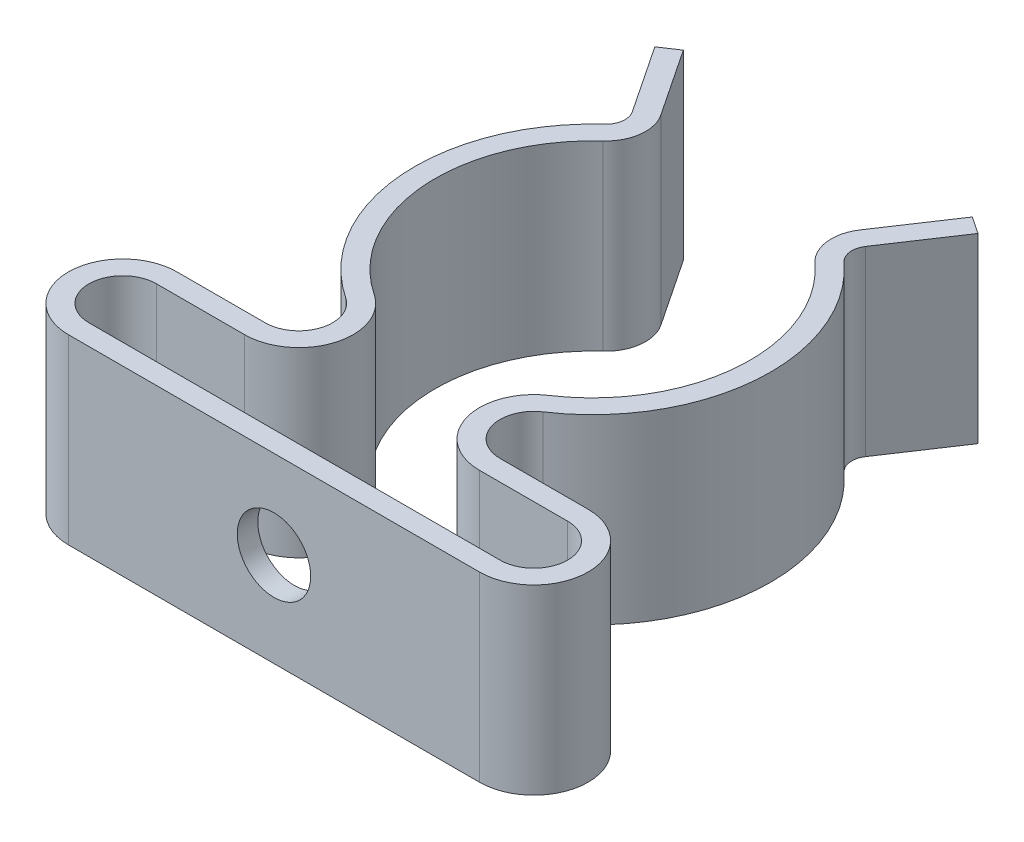
ISO-10303-21;
HEADER;
FILE_DESCRIPTION(('STEP AP214'),'2;1');
FILE_NAME('part.step','',(''),(''),'','','');
FILE_SCHEMA(('AUTOMOTIVE_DESIGN { 1 0 10303 214 1 1 1 1 }'));
ENDSEC;
DATA;
#1=APPLICATION_CONTEXT('core data for automotive mechanical design processes');
#2=APPLICATION_PROTOCOL_DEFINITION('international standard','automotive_design',2000,#1);
#3=PRODUCT_CONTEXT('',#1,'mechanical');
#4=PRODUCT('Part','Part','',(#3));
#5=PRODUCT_RELATED_PRODUCT_CATEGORY('part','',(#4));
#6=PRODUCT_DEFINITION_FORMATION('','',#4);
#7=PRODUCT_DEFINITION_CONTEXT('part definition',#1,'design');
#8=PRODUCT_DEFINITION('design','',#6,#7);
#9=PRODUCT_DEFINITION_SHAPE('','',#8);
#10=(LENGTH_UNIT() NAMED_UNIT(*) SI_UNIT(.MILLI.,.METRE.));
#11=(NAMED_UNIT(*) PLANE_ANGLE_UNIT() SI_UNIT($,.RADIAN.));
#12=(NAMED_UNIT(*) SI_UNIT($,.STERADIAN.) SOLID_ANGLE_UNIT());
#13=UNCERTAINTY_MEASURE_WITH_UNIT(LENGTH_MEASURE(1.E-05),#10,'distance_accuracy_value','');
#14=(GEOMETRIC_REPRESENTATION_CONTEXT(3) GLOBAL_UNCERTAINTY_ASSIGNED_CONTEXT((#13)) GLOBAL_UNIT_ASSIGNED_CONTEXT((#10,
#11,#12)) REPRESENTATION_CONTEXT('',''));
#15=CARTESIAN_POINT('',(0.,0.,0.));
#16=DIRECTION('',(0.,0.,1.));
#17=DIRECTION('',(1.,0.,0.));
#18=AXIS2_PLACEMENT_3D('',#15,#16,#17);
#19=CARTESIAN_POINT('',(-3.38987326577729,-0.2,-16.2157813718721));
#20=DIRECTION('',(0.832050294337843,0.,-0.554700196225229));
#21=DIRECTION('',(-0.554700196225229,0.,-0.832050294337843));
#22=AXIS2_PLACEMENT_3D('',#19,#20,#21);
#23=PLANE('',#22);
#24=DIRECTION('',(0.,1.,0.));
#25=VECTOR('',#24,1.);
#26=CARTESIAN_POINT('',(-4.91988494790974,-0.2,-18.5107988950708));
#27=LINE('',#26,#25);
#28=CARTESIAN_POINT('',(-4.91988494790974,-0.2,-18.5107988950708));
#29=VERTEX_POINT('',#28);
#30=CARTESIAN_POINT('',(-4.91988494790974,6.,-18.5107988950708));
#31=VERTEX_POINT('',#30);
#32=EDGE_CURVE('E34',#29,#31,#27,.T.);
#33=ORIENTED_EDGE('',*,*,#32,.T.);
#34=DIRECTION('',(-0.554700196225229,0.,-0.832050294337844));
#35=VECTOR('',#34,1.);
#36=CARTESIAN_POINT('',(-3.38987326577729,6.,-16.2157813718721));
#37=LINE('',#36,#35);
#38=CARTESIAN_POINT('',(-3.38987326577729,6.,-16.2157813718721));
#39=VERTEX_POINT('',#38);
#40=EDGE_CURVE('E215',#39,#31,#37,.T.);
#41=ORIENTED_EDGE('',*,*,#40,.F.);
#42=DIRECTION('',(0.,1.,0.));
#43=VECTOR('',#42,1.);
#44=CARTESIAN_POINT('',(-3.38987326577729,-0.2,-16.2157813718721));
#45=LINE('',#44,#43);
#46=CARTESIAN_POINT('',(-3.38987326577729,-0.2,-16.2157813718721));
#47=VERTEX_POINT('',#46);
#48=EDGE_CURVE('E11',#47,#39,#45,.T.);
#49=ORIENTED_EDGE('',*,*,#48,.F.);
#50=DIRECTION('',(-0.554700196225229,0.,-0.832050294337844));
#51=VECTOR('',#50,1.);
#52=CARTESIAN_POINT('',(-3.38987326577729,-0.2,-16.2157813718721));
#53=LINE('',#52,#51);
#54=EDGE_CURVE('E216',#47,#29,#53,.T.);
#55=ORIENTED_EDGE('',*,*,#54,.T.);
#56=EDGE_LOOP('',(#33,#41,#49,#55));
#57=FACE_BOUND('',#56,.T.);
#58=ADVANCED_FACE('F31',(#57),#23,.T.);
#59=CARTESIAN_POINT('',(-4.51314116313338,-0.2,-15.4669361069681));
#60=DIRECTION('',(0.,1.,0.));
#61=DIRECTION('',(0.,0.,1.));
#62=AXIS2_PLACEMENT_3D('',#59,#60,#61);
#63=CYLINDRICAL_SURFACE('',#62,1.35);
#64=ORIENTED_EDGE('',*,*,#48,.T.);
#65=CARTESIAN_POINT('',(-4.51314116313338,6.,-15.4669361069681));
#66=DIRECTION('',(0.,1.,0.));
#67=DIRECTION('',(1.,0.,0.));
#68=AXIS2_PLACEMENT_3D('',#65,#66,#67);
#69=CIRCLE('',#68,1.35);
#70=CARTESIAN_POINT('',(-3.60528131089679,6.,-14.4677912282358));
#71=VERTEX_POINT('',#70);
#72=EDGE_CURVE('E230',#71,#39,#69,.T.);
#73=ORIENTED_EDGE('',*,*,#72,.F.);
#74=DIRECTION('',(0.,1.,0.));
#75=VECTOR('',#74,1.);
#76=CARTESIAN_POINT('',(-3.60528131089679,-0.2,-14.4677912282358));
#77=LINE('',#76,#75);
#78=CARTESIAN_POINT('',(-3.60528131089679,-0.2,-14.4677912282358));
#79=VERTEX_POINT('',#78);
#80=EDGE_CURVE('E39',#79,#71,#77,.T.);
#81=ORIENTED_EDGE('',*,*,#80,.F.);
#82=CARTESIAN_POINT('',(-4.51314116313338,-0.2,-15.4669361069681));
#83=DIRECTION('',(0.,1.,0.));
#84=DIRECTION('',(1.,0.,0.));
#85=AXIS2_PLACEMENT_3D('',#82,#83,#84);
#86=CIRCLE('',#85,1.35);
#87=EDGE_CURVE('E221',#79,#47,#86,.T.);
#88=ORIENTED_EDGE('',*,*,#87,.T.);
#89=EDGE_LOOP('',(#64,#73,#81,#88));
#90=FACE_BOUND('',#89,.T.);
#91=ADVANCED_FACE('F539',(#90),#63,.T.);
#92=CARTESIAN_POINT('',(0.,-0.2,-10.5));
#93=DIRECTION('',(0.,1.,0.));
#94=DIRECTION('',(0.,0.,1.));
#95=AXIS2_PLACEMENT_3D('',#92,#93,#94);
#96=CYLINDRICAL_SURFACE('',#95,5.36110255092798);
#97=ORIENTED_EDGE('',*,*,#80,.T.);
#98=CARTESIAN_POINT('',(0.,6.,-10.5));
#99=DIRECTION('',(0.,1.,0.));
#100=DIRECTION('',(1.,0.,0.));
#101=AXIS2_PLACEMENT_3D('',#98,#99,#100);
#102=CIRCLE('',#101,5.36110255092798);
#103=CARTESIAN_POINT('',(-2.97380463698333,6.,-6.03929304452501));
#104=VERTEX_POINT('',#103);
#105=EDGE_CURVE('E309',#104,#71,#102,.F.);
#106=ORIENTED_EDGE('',*,*,#105,.F.);
#107=DIRECTION('',(0.,1.,0.));
#108=VECTOR('',#107,1.);
#109=CARTESIAN_POINT('',(-2.97380463698333,-0.2,-6.03929304452501));
#110=LINE('',#109,#108);
#111=CARTESIAN_POINT('',(-2.97380463698333,-0.2,-6.03929304452501));
#112=VERTEX_POINT('',#111);
#113=EDGE_CURVE('E377',#112,#104,#110,.T.);
#114=ORIENTED_EDGE('',*,*,#113,.F.);
#115=CARTESIAN_POINT('',(0.,-0.2,-10.5));
#116=DIRECTION('',(0.,1.,0.));
#117=DIRECTION('',(1.,0.,0.));
#118=AXIS2_PLACEMENT_3D('',#115,#116,#117);
#119=CIRCLE('',#118,5.36110255092798);
#120=EDGE_CURVE('E373',#112,#79,#119,.F.);
#121=ORIENTED_EDGE('',*,*,#120,.T.);
#122=EDGE_LOOP('',(#97,#106,#114,#121));
#123=FACE_BOUND('',#122,.T.);
#124=ADVANCED_FACE('F538',(#123),#96,.F.);
#125=CARTESIAN_POINT('',(-4.,-0.2,-4.5));
#126=DIRECTION('',(0.,1.,0.));
#127=DIRECTION('',(0.,0.,1.));
#128=AXIS2_PLACEMENT_3D('',#125,#126,#127);
#129=CYLINDRICAL_SURFACE('',#128,1.85);
#130=ORIENTED_EDGE('',*,*,#113,.T.);
#131=CARTESIAN_POINT('',(-4.,6.,-4.5));
#132=DIRECTION('',(0.,1.,0.));
#133=DIRECTION('',(1.,0.,0.));
#134=AXIS2_PLACEMENT_3D('',#131,#132,#133);
#135=CIRCLE('',#134,1.85);
#136=CARTESIAN_POINT('',(-4.,6.,-2.65));
#137=VERTEX_POINT('',#136);
#138=EDGE_CURVE('E306',#137,#104,#135,.T.);
#139=ORIENTED_EDGE('',*,*,#138,.F.);
#140=DIRECTION('',(0.,1.,0.));
#141=VECTOR('',#140,1.);
#142=CARTESIAN_POINT('',(-4.,-0.2,-2.65));
#143=LINE('',#142,#141);
#144=CARTESIAN_POINT('',(-4.,-0.2,-2.65));
#145=VERTEX_POINT('',#144);
#146=EDGE_CURVE('E379',#145,#137,#143,.T.);
#147=ORIENTED_EDGE('',*,*,#146,.F.);
#148=CARTESIAN_POINT('',(-4.,-0.2,-4.5));
#149=DIRECTION('',(0.,1.,0.));
#150=DIRECTION('',(1.,0.,0.));
#151=AXIS2_PLACEMENT_3D('',#148,#149,#150);
#152=CIRCLE('',#151,1.85);
#153=EDGE_CURVE('E370',#145,#112,#152,.T.);
#154=ORIENTED_EDGE('',*,*,#153,.T.);
#155=EDGE_LOOP('',(#130,#139,#147,#154));
#156=FACE_BOUND('',#155,.T.);
#157=ADVANCED_FACE('F534',(#156),#129,.T.);
#158=CARTESIAN_POINT('',(-7.,-0.2,-2.65));
#159=DIRECTION('',(0.,0.,1.));
#160=DIRECTION('',(1.,0.,0.));
#161=AXIS2_PLACEMENT_3D('',#158,#159,#160);
#162=PLANE('',#161);
#163=ORIENTED_EDGE('',*,*,#146,.T.);
#164=DIRECTION('',(1.,0.,0.));
#165=VECTOR('',#164,1.);
#166=CARTESIAN_POINT('',(-7.,6.,-2.65));
#167=LINE('',#166,#165);
#168=CARTESIAN_POINT('',(-7.,6.,-2.65));
#169=VERTEX_POINT('',#168);
#170=EDGE_CURVE('E303',#169,#137,#167,.T.);
#171=ORIENTED_EDGE('',*,*,#170,.F.);
#172=DIRECTION('',(0.,1.,0.));
#173=VECTOR('',#172,1.);
#174=CARTESIAN_POINT('',(-7.,-0.2,-2.65));
#175=LINE('',#174,#173);
#176=CARTESIAN_POINT('',(-7.,-0.2,-2.65));
#177=VERTEX_POINT('',#176);
#178=EDGE_CURVE('E381',#177,#169,#175,.T.);
#179=ORIENTED_EDGE('',*,*,#178,.F.);
#180=DIRECTION('',(1.,0.,0.));
#181=VECTOR('',#180,1.);
#182=CARTESIAN_POINT('',(-7.,-0.2,-2.65));
#183=LINE('',#182,#181);
#184=EDGE_CURVE('E367',#177,#145,#183,.T.);
#185=ORIENTED_EDGE('',*,*,#184,.T.);
#186=EDGE_LOOP('',(#163,#171,#179,#185));
#187=FACE_BOUND('',#186,.T.);
#188=ADVANCED_FACE('F529',(#187),#162,.T.);
#189=CARTESIAN_POINT('',(-7.,-0.2,-1.5));
#190=DIRECTION('',(0.,1.,0.));
#191=DIRECTION('',(0.,0.,1.));
#192=AXIS2_PLACEMENT_3D('',#189,#190,#191);
#193=CYLINDRICAL_SURFACE('',#192,1.15);
#194=ORIENTED_EDGE('',*,*,#178,.T.);
#195=CARTESIAN_POINT('',(-7.,6.,-1.5));
#196=DIRECTION('',(0.,1.,0.));
#197=DIRECTION('',(1.,0.,0.));
#198=AXIS2_PLACEMENT_3D('',#195,#196,#197);
#199=CIRCLE('',#198,1.15);
#200=CARTESIAN_POINT('',(-7.,6.,-0.35));
#201=VERTEX_POINT('',#200);
#202=EDGE_CURVE('E300',#201,#169,#199,.F.);
#203=ORIENTED_EDGE('',*,*,#202,.F.);
#204=DIRECTION('',(0.,1.,0.));
#205=VECTOR('',#204,1.);
#206=CARTESIAN_POINT('',(-7.,-0.2,-0.35));
#207=LINE('',#206,#205);
#208=CARTESIAN_POINT('',(-7.,-0.2,-0.35));
#209=VERTEX_POINT('',#208);
#210=EDGE_CURVE('E383',#209,#201,#207,.T.);
#211=ORIENTED_EDGE('',*,*,#210,.F.);
#212=CARTESIAN_POINT('',(-7.,-0.2,-1.5));
#213=DIRECTION('',(0.,1.,0.));
#214=DIRECTION('',(1.,0.,0.));
#215=AXIS2_PLACEMENT_3D('',#212,#213,#214);
#216=CIRCLE('',#215,1.15);
#217=EDGE_CURVE('E364',#209,#177,#216,.F.);
#218=ORIENTED_EDGE('',*,*,#217,.T.);
#219=EDGE_LOOP('',(#194,#203,#211,#218));
#220=FACE_BOUND('',#219,.T.);
#221=ADVANCED_FACE('F527',(#220),#193,.F.);
#222=CARTESIAN_POINT('',(-7.,-0.2,-0.35));
#223=DIRECTION('',(0.,0.,-1.));
#224=DIRECTION('',(-1.,0.,0.));
#225=AXIS2_PLACEMENT_3D('',#222,#223,#224);
#226=PLANE('',#225);
#227=CARTESIAN_POINT('',(0.,3.,-0.35));
#228=DIRECTION('',(0.,0.,-1.));
#229=DIRECTION('',(-1.,0.,0.));
#230=AXIS2_PLACEMENT_3D('',#227,#228,#229);
#231=CIRCLE('',#230,1.25);
#232=CARTESIAN_POINT('',(-1.25,3.,-0.35));
#233=VERTEX_POINT('',#232);
#234=EDGE_CURVE('E617',#233,#233,#231,.F.);
#235=ORIENTED_EDGE('',*,*,#234,.T.);
#236=EDGE_LOOP('',(#235));
#237=FACE_BOUND('',#236,.T.);
#238=ORIENTED_EDGE('',*,*,#210,.T.);
#239=DIRECTION('',(1.,0.,0.));
#240=VECTOR('',#239,1.);
#241=CARTESIAN_POINT('',(-7.,6.,-0.35));
#242=LINE('',#241,#240);
#243=CARTESIAN_POINT('',(7.,6.,-0.35));
#244=VERTEX_POINT('',#243);
#245=EDGE_CURVE('E297',#244,#201,#242,.F.);
#246=ORIENTED_EDGE('',*,*,#245,.F.);
#247=DIRECTION('',(0.,1.,0.));
#248=VECTOR('',#247,1.);
#249=CARTESIAN_POINT('',(7.,-0.2,-0.35));
#250=LINE('',#249,#248);
#251=CARTESIAN_POINT('',(7.,-0.2,-0.35));
#252=VERTEX_POINT('',#251);
#253=EDGE_CURVE('E385',#252,#244,#250,.T.);
#254=ORIENTED_EDGE('',*,*,#253,.F.);
#255=DIRECTION('',(1.,0.,0.));
#256=VECTOR('',#255,1.);
#257=CARTESIAN_POINT('',(-7.,-0.2,-0.35));
#258=LINE('',#257,#256);
#259=EDGE_CURVE('E361',#252,#209,#258,.F.);
#260=ORIENTED_EDGE('',*,*,#259,.T.);
#261=EDGE_LOOP('',(#238,#246,#254,#260));
#262=FACE_BOUND('',#261,.T.);
#263=ADVANCED_FACE('F522',(#237,#262),#226,.T.);
#264=CARTESIAN_POINT('',(7.,-0.2,-1.5));
#265=DIRECTION('',(0.,1.,0.));
#266=DIRECTION('',(0.,0.,1.));
#267=AXIS2_PLACEMENT_3D('',#264,#265,#266);
#268=CYLINDRICAL_SURFACE('',#267,1.15);
#269=ORIENTED_EDGE('',*,*,#253,.T.);
#270=CARTESIAN_POINT('',(7.,6.,-1.5));
#271=DIRECTION('',(0.,1.,0.));
#272=DIRECTION('',(1.,0.,0.));
#273=AXIS2_PLACEMENT_3D('',#270,#271,#272);
#274=CIRCLE('',#273,1.15);
#275=CARTESIAN_POINT('',(7.,6.,-2.65));
#276=VERTEX_POINT('',#275);
#277=EDGE_CURVE('E294',#276,#244,#274,.F.);
#278=ORIENTED_EDGE('',*,*,#277,.F.);
#279=DIRECTION('',(0.,1.,0.));
#280=VECTOR('',#279,1.);
#281=CARTESIAN_POINT('',(7.,-0.2,-2.65));
#282=LINE('',#281,#280);
#283=CARTESIAN_POINT('',(7.,-0.2,-2.65));
#284=VERTEX_POINT('',#283);
#285=EDGE_CURVE('E387',#284,#276,#282,.T.);
#286=ORIENTED_EDGE('',*,*,#285,.F.);
#287=CARTESIAN_POINT('',(7.,-0.2,-1.5));
#288=DIRECTION('',(0.,1.,0.));
#289=DIRECTION('',(1.,0.,0.));
#290=AXIS2_PLACEMENT_3D('',#287,#288,#289);
#291=CIRCLE('',#290,1.15);
#292=EDGE_CURVE('E358',#284,#252,#291,.F.);
#293=ORIENTED_EDGE('',*,*,#292,.T.);
#294=EDGE_LOOP('',(#269,#278,#286,#293));
#295=FACE_BOUND('',#294,.T.);
#296=ADVANCED_FACE('F517',(#295),#268,.F.);
#297=CARTESIAN_POINT('',(7.,-0.2,-2.65));
#298=DIRECTION('',(0.,0.,1.));
#299=DIRECTION('',(1.,0.,0.));
#300=AXIS2_PLACEMENT_3D('',#297,#298,#299);
#301=PLANE('',#300);
#302=ORIENTED_EDGE('',*,*,#285,.T.);
#303=DIRECTION('',(1.,0.,0.));
#304=VECTOR('',#303,1.);
#305=CARTESIAN_POINT('',(7.,6.,-2.65));
#306=LINE('',#305,#304);
#307=CARTESIAN_POINT('',(4.,6.,-2.65));
#308=VERTEX_POINT('',#307);
#309=EDGE_CURVE('E291',#308,#276,#306,.T.);
#310=ORIENTED_EDGE('',*,*,#309,.F.);
#311=DIRECTION('',(0.,1.,0.));
#312=VECTOR('',#311,1.);
#313=CARTESIAN_POINT('',(4.,-0.2,-2.65));
#314=LINE('',#313,#312);
#315=CARTESIAN_POINT('',(4.,-0.2,-2.65));
#316=VERTEX_POINT('',#315);
#317=EDGE_CURVE('E389',#316,#308,#314,.T.);
#318=ORIENTED_EDGE('',*,*,#317,.F.);
#319=DIRECTION('',(1.,0.,0.));
#320=VECTOR('',#319,1.);
#321=CARTESIAN_POINT('',(7.,-0.2,-2.65));
#322=LINE('',#321,#320);
#323=EDGE_CURVE('E355',#316,#284,#322,.T.);
#324=ORIENTED_EDGE('',*,*,#323,.T.);
#325=EDGE_LOOP('',(#302,#310,#318,#324));
#326=FACE_BOUND('',#325,.T.);
#327=ADVANCED_FACE('F515',(#326),#301,.T.);
#328=CARTESIAN_POINT('',(4.,-0.2,-4.5));
#329=DIRECTION('',(0.,1.,0.));
#330=DIRECTION('',(0.,0.,1.));
#331=AXIS2_PLACEMENT_3D('',#328,#329,#330);
#332=CYLINDRICAL_SURFACE('',#331,1.85);
#333=ORIENTED_EDGE('',*,*,#317,.T.);
#334=CARTESIAN_POINT('',(4.,6.,-4.5));
#335=DIRECTION('',(0.,1.,0.));
#336=DIRECTION('',(1.,0.,0.));
#337=AXIS2_PLACEMENT_3D('',#334,#335,#336);
#338=CIRCLE('',#337,1.85);
#339=CARTESIAN_POINT('',(2.97380463698333,6.,-6.03929304452501));
#340=VERTEX_POINT('',#339);
#341=EDGE_CURVE('E288',#340,#308,#338,.T.);
#342=ORIENTED_EDGE('',*,*,#341,.F.);
#343=DIRECTION('',(0.,1.,0.));
#344=VECTOR('',#343,1.);
#345=CARTESIAN_POINT('',(2.97380463698333,-0.2,-6.03929304452501));
#346=LINE('',#345,#344);
#347=CARTESIAN_POINT('',(2.97380463698333,-0.2,-6.03929304452501));
#348=VERTEX_POINT('',#347);
#349=EDGE_CURVE('E391',#348,#340,#346,.T.);
#350=ORIENTED_EDGE('',*,*,#349,.F.);
#351=CARTESIAN_POINT('',(4.,-0.2,-4.5));
#352=DIRECTION('',(0.,1.,0.));
#353=DIRECTION('',(1.,0.,0.));
#354=AXIS2_PLACEMENT_3D('',#351,#352,#353);
#355=CIRCLE('',#354,1.85);
#356=EDGE_CURVE('E352',#348,#316,#355,.T.);
#357=ORIENTED_EDGE('',*,*,#356,.T.);
#358=EDGE_LOOP('',(#333,#342,#350,#357));
#359=FACE_BOUND('',#358,.T.);
#360=ADVANCED_FACE('F510',(#359),#332,.T.);
#361=CARTESIAN_POINT('',(0.,-0.2,-10.5));
#362=DIRECTION('',(0.,1.,0.));
#363=DIRECTION('',(0.,0.,1.));
#364=AXIS2_PLACEMENT_3D('',#361,#362,#363);
#365=CYLINDRICAL_SURFACE('',#364,5.36110255092798);
#366=ORIENTED_EDGE('',*,*,#349,.T.);
#367=CARTESIAN_POINT('',(0.,6.,-10.5));
#368=DIRECTION('',(0.,1.,0.));
#369=DIRECTION('',(1.,0.,0.));
#370=AXIS2_PLACEMENT_3D('',#367,#368,#369);
#371=CIRCLE('',#370,5.36110255092798);
#372=CARTESIAN_POINT('',(3.60528131089679,6.,-14.4677912282358));
#373=VERTEX_POINT('',#372);
#374=EDGE_CURVE('E285',#373,#340,#371,.F.);
#375=ORIENTED_EDGE('',*,*,#374,.F.);
#376=DIRECTION('',(0.,1.,0.));
#377=VECTOR('',#376,1.);
#378=CARTESIAN_POINT('',(3.60528131089679,-0.2,-14.4677912282358));
#379=LINE('',#378,#377);
#380=CARTESIAN_POINT('',(3.60528131089679,-0.2,-14.4677912282358));
#381=VERTEX_POINT('',#380);
#382=EDGE_CURVE('E393',#381,#373,#379,.T.);
#383=ORIENTED_EDGE('',*,*,#382,.F.);
#384=CARTESIAN_POINT('',(0.,-0.2,-10.5));
#385=DIRECTION('',(0.,1.,0.));
#386=DIRECTION('',(1.,0.,0.));
#387=AXIS2_PLACEMENT_3D('',#384,#385,#386);
#388=CIRCLE('',#387,5.36110255092798);
#389=EDGE_CURVE('E349',#381,#348,#388,.F.);
#390=ORIENTED_EDGE('',*,*,#389,.T.);
#391=EDGE_LOOP('',(#366,#375,#383,#390));
#392=FACE_BOUND('',#391,.T.);
#393=ADVANCED_FACE('F503',(#392),#365,.F.);
#394=CARTESIAN_POINT('',(4.51314116313338,-0.2,-15.4669361069681));
#395=DIRECTION('',(0.,1.,0.));
#396=DIRECTION('',(0.,0.,1.));
#397=AXIS2_PLACEMENT_3D('',#394,#395,#396);
#398=CYLINDRICAL_SURFACE('',#397,1.35);
#399=ORIENTED_EDGE('',*,*,#382,.T.);
#400=CARTESIAN_POINT('',(4.51314116313338,6.,-15.4669361069681));
#401=DIRECTION('',(0.,1.,0.));
#402=DIRECTION('',(1.,0.,0.));
#403=AXIS2_PLACEMENT_3D('',#400,#401,#402);
#404=CIRCLE('',#403,1.35);
#405=CARTESIAN_POINT('',(3.38987326577729,6.,-16.2157813718721));
#406=VERTEX_POINT('',#405);
#407=EDGE_CURVE('E282',#406,#373,#404,.T.);
#408=ORIENTED_EDGE('',*,*,#407,.F.);
#409=DIRECTION('',(0.,1.,0.));
#410=VECTOR('',#409,1.);
#411=CARTESIAN_POINT('',(3.38987326577729,-0.2,-16.2157813718721));
#412=LINE('',#411,#410);
#413=CARTESIAN_POINT('',(3.38987326577729,-0.2,-16.2157813718721));
#414=VERTEX_POINT('',#413);
#415=EDGE_CURVE('E395',#414,#406,#412,.T.);
#416=ORIENTED_EDGE('',*,*,#415,.F.);
#417=CARTESIAN_POINT('',(4.51314116313338,-0.2,-15.4669361069681));
#418=DIRECTION('',(0.,1.,0.));
#419=DIRECTION('',(1.,0.,0.));
#420=AXIS2_PLACEMENT_3D('',#417,#418,#419);
#421=CIRCLE('',#420,1.35);
#422=EDGE_CURVE('E346',#414,#381,#421,.T.);
#423=ORIENTED_EDGE('',*,*,#422,.T.);
#424=EDGE_LOOP('',(#399,#408,#416,#423));
#425=FACE_BOUND('',#424,.T.);
#426=ADVANCED_FACE('F499',(#425),#398,.T.);
#427=CARTESIAN_POINT('',(3.38987326577729,-0.2,-16.2157813718721));
#428=DIRECTION('',(-0.832050294337843,0.,-0.554700196225229));
#429=DIRECTION('',(-0.554700196225229,0.,0.832050294337843));
#430=AXIS2_PLACEMENT_3D('',#427,#428,#429);
#431=PLANE('',#430);
#432=ORIENTED_EDGE('',*,*,#415,.T.);
#433=DIRECTION('',(-0.554700196225229,0.,0.832050294337844));
#434=VECTOR('',#433,1.);
#435=CARTESIAN_POINT('',(3.38987326577729,6.,-16.2157813718721));
#436=LINE('',#435,#434);
#437=CARTESIAN_POINT('',(4.91988494790974,6.,-18.5107988950708));
#438=VERTEX_POINT('',#437);
#439=EDGE_CURVE('E279',#438,#406,#436,.T.);
#440=ORIENTED_EDGE('',*,*,#439,.F.);
#441=DIRECTION('',(0.,1.,0.));
#442=VECTOR('',#441,1.);
#443=CARTESIAN_POINT('',(4.91988494790974,-0.2,-18.5107988950708));
#444=LINE('',#443,#442);
#445=CARTESIAN_POINT('',(4.91988494790974,-0.2,-18.5107988950708));
#446=VERTEX_POINT('',#445);
#447=EDGE_CURVE('E397',#446,#438,#444,.T.);
#448=ORIENTED_EDGE('',*,*,#447,.F.);
#449=DIRECTION('',(-0.554700196225229,0.,0.832050294337844));
#450=VECTOR('',#449,1.);
#451=CARTESIAN_POINT('',(3.38987326577729,-0.2,-16.2157813718721));
#452=LINE('',#451,#450);
#453=EDGE_CURVE('E343',#446,#414,#452,.T.);
#454=ORIENTED_EDGE('',*,*,#453,.T.);
#455=EDGE_LOOP('',(#432,#440,#448,#454));
#456=FACE_BOUND('',#455,.T.);
#457=ADVANCED_FACE('F495',(#456),#431,.T.);
#458=CARTESIAN_POINT('',(4.91988494790974,-0.2,-18.5107988950708));
#459=DIRECTION('',(-0.554700196225228,0.,0.832050294337844));
#460=DIRECTION('',(0.832050294337844,0.,0.554700196225228));
#461=AXIS2_PLACEMENT_3D('',#458,#459,#460);
#462=PLANE('',#461);
#463=ORIENTED_EDGE('',*,*,#447,.T.);
#464=DIRECTION('',(0.832050294337844,0.,0.554700196225228));
#465=VECTOR('',#464,1.);
#466=CARTESIAN_POINT('',(4.91988494790974,6.,-18.5107988950708));
#467=LINE('',#466,#465);
#468=CARTESIAN_POINT('',(5.50232015394623,6.,-18.1225087577131));
#469=VERTEX_POINT('',#468);
#470=EDGE_CURVE('E276',#438,#469,#467,.T.);
#471=ORIENTED_EDGE('',*,*,#470,.T.);
#472=DIRECTION('',(0.,1.,0.));
#473=VECTOR('',#472,1.);
#474=CARTESIAN_POINT('',(5.50232015394623,-0.2,-18.1225087577131));
#475=LINE('',#474,#473);
#476=CARTESIAN_POINT('',(5.50232015394623,-0.2,-18.1225087577131));
#477=VERTEX_POINT('',#476);
#478=EDGE_CURVE('E399',#477,#469,#475,.T.);
#479=ORIENTED_EDGE('',*,*,#478,.F.);
#480=DIRECTION('',(0.832050294337844,0.,0.554700196225228));
#481=VECTOR('',#480,1.);
#482=CARTESIAN_POINT('',(4.91988494790974,-0.2,-18.5107988950708));
#483=LINE('',#482,#481);
#484=EDGE_CURVE('E341',#446,#477,#483,.T.);
#485=ORIENTED_EDGE('',*,*,#484,.F.);
#486=EDGE_LOOP('',(#463,#471,#479,#485));
#487=FACE_BOUND('',#486,.T.);
#488=ADVANCED_FACE('F490',(#487),#462,.F.);
#489=CARTESIAN_POINT('',(3.97230847181378,-0.2,-15.8274912345145));
#490=DIRECTION('',(-0.832050294337843,0.,-0.554700196225229));
#491=DIRECTION('',(-0.554700196225229,0.,0.832050294337843));
#492=AXIS2_PLACEMENT_3D('',#489,#490,#491);
#493=PLANE('',#492);
#494=ORIENTED_EDGE('',*,*,#478,.T.);
#495=DIRECTION('',(-0.554700196225229,0.,0.832050294337844));
#496=VECTOR('',#495,1.);
#497=CARTESIAN_POINT('',(3.97230847181378,6.,-15.8274912345145));
#498=LINE('',#497,#496);
#499=CARTESIAN_POINT('',(3.97230847181378,6.,-15.8274912345145));
#500=VERTEX_POINT('',#499);
#501=EDGE_CURVE('E273',#469,#500,#498,.T.);
#502=ORIENTED_EDGE('',*,*,#501,.T.);
#503=DIRECTION('',(0.,1.,0.));
#504=VECTOR('',#503,1.);
#505=CARTESIAN_POINT('',(3.97230847181378,-0.2,-15.8274912345145));
#506=LINE('',#505,#504);
#507=CARTESIAN_POINT('',(3.97230847181378,-0.2,-15.8274912345145));
#508=VERTEX_POINT('',#507);
#509=EDGE_CURVE('E401',#508,#500,#506,.T.);
#510=ORIENTED_EDGE('',*,*,#509,.F.);
#511=DIRECTION('',(-0.554700196225229,0.,0.832050294337844));
#512=VECTOR('',#511,1.);
#513=CARTESIAN_POINT('',(3.97230847181378,-0.2,-15.8274912345145));
#514=LINE('',#513,#512);
#515=EDGE_CURVE('E339',#477,#508,#514,.T.);
#516=ORIENTED_EDGE('',*,*,#515,.F.);
#517=EDGE_LOOP('',(#494,#502,#510,#516));
#518=FACE_BOUND('',#517,.T.);
#519=ADVANCED_FACE('F486',(#518),#493,.F.);
#520=CARTESIAN_POINT('',(4.51314116313338,-0.2,-15.4669361069681));
#521=DIRECTION('',(0.,1.,0.));
#522=DIRECTION('',(0.,0.,1.));
#523=AXIS2_PLACEMENT_3D('',#520,#521,#522);
#524=CYLINDRICAL_SURFACE('',#523,0.649999999999999);
#525=ORIENTED_EDGE('',*,*,#509,.T.);
#526=CARTESIAN_POINT('',(4.51314116313338,6.,-15.4669361069681));
#527=DIRECTION('',(0.,1.,0.));
#528=DIRECTION('',(1.,0.,0.));
#529=AXIS2_PLACEMENT_3D('',#526,#527,#528);
#530=CIRCLE('',#529,0.649999999999999);
#531=CARTESIAN_POINT('',(4.07602345650095,6.,-14.9858663505414));
#532=VERTEX_POINT('',#531);
#533=EDGE_CURVE('E270',#500,#532,#530,.T.);
#534=ORIENTED_EDGE('',*,*,#533,.T.);
#535=DIRECTION('',(0.,1.,0.));
#536=VECTOR('',#535,1.);
#537=CARTESIAN_POINT('',(4.07602345650095,-0.2,-14.9858663505414));
#538=LINE('',#537,#536);
#539=CARTESIAN_POINT('',(4.07602345650095,-0.2,-14.9858663505414));
#540=VERTEX_POINT('',#539);
#541=EDGE_CURVE('E403',#540,#532,#538,.T.);
#542=ORIENTED_EDGE('',*,*,#541,.F.);
#543=CARTESIAN_POINT('',(4.51314116313338,-0.2,-15.4669361069681));
#544=DIRECTION('',(0.,1.,0.));
#545=DIRECTION('',(1.,0.,0.));
#546=AXIS2_PLACEMENT_3D('',#543,#544,#545);
#547=CIRCLE('',#546,0.649999999999999);
#548=EDGE_CURVE('E337',#508,#540,#547,.T.);
#549=ORIENTED_EDGE('',*,*,#548,.F.);
#550=EDGE_LOOP('',(#525,#534,#542,#549));
#551=FACE_BOUND('',#550,.T.);
#552=ADVANCED_FACE('F481',(#551),#524,.F.);
#553=CARTESIAN_POINT('',(0.,-0.2,-10.5));
#554=DIRECTION('',(0.,1.,0.));
#555=DIRECTION('',(0.,0.,1.));
#556=AXIS2_PLACEMENT_3D('',#553,#554,#555);
#557=CYLINDRICAL_SURFACE('',#556,6.06110255092798);
#558=ORIENTED_EDGE('',*,*,#541,.T.);
#559=CARTESIAN_POINT('',(0.,6.,-10.5));
#560=DIRECTION('',(0.,1.,0.));
#561=DIRECTION('',(1.,0.,0.));
#562=AXIS2_PLACEMENT_3D('',#559,#560,#561);
#563=CIRCLE('',#562,6.06110255092798);
#564=CARTESIAN_POINT('',(3.36209477434099,6.,-5.45685783848852));
#565=VERTEX_POINT('',#564);
#566=EDGE_CURVE('E267',#532,#565,#563,.F.);
#567=ORIENTED_EDGE('',*,*,#566,.T.);
#568=DIRECTION('',(0.,1.,0.));
#569=VECTOR('',#568,1.);
#570=CARTESIAN_POINT('',(3.36209477434099,-0.2,-5.45685783848852));
#571=LINE('',#570,#569);
#572=CARTESIAN_POINT('',(3.36209477434099,-0.2,-5.45685783848852));
#573=VERTEX_POINT('',#572);
#574=EDGE_CURVE('E405',#573,#565,#571,.T.);
#575=ORIENTED_EDGE('',*,*,#574,.F.);
#576=CARTESIAN_POINT('',(0.,-0.2,-10.5));
#577=DIRECTION('',(0.,1.,0.));
#578=DIRECTION('',(1.,0.,0.));
#579=AXIS2_PLACEMENT_3D('',#576,#577,#578);
#580=CIRCLE('',#579,6.06110255092798);
#581=EDGE_CURVE('E335',#540,#573,#580,.F.);
#582=ORIENTED_EDGE('',*,*,#581,.F.);
#583=EDGE_LOOP('',(#558,#567,#575,#582));
#584=FACE_BOUND('',#583,.T.);
#585=ADVANCED_FACE('F476',(#584),#557,.T.);
#586=CARTESIAN_POINT('',(4.,-0.2,-4.5));
#587=DIRECTION('',(0.,1.,0.));
#588=DIRECTION('',(0.,0.,1.));
#589=AXIS2_PLACEMENT_3D('',#586,#587,#588);
#590=CYLINDRICAL_SURFACE('',#589,1.15);
#591=ORIENTED_EDGE('',*,*,#574,.T.);
#592=CARTESIAN_POINT('',(4.,6.,-4.5));
#593=DIRECTION('',(0.,1.,0.));
#594=DIRECTION('',(1.,0.,0.));
#595=AXIS2_PLACEMENT_3D('',#592,#593,#594);
#596=CIRCLE('',#595,1.15);
#597=CARTESIAN_POINT('',(4.,6.,-3.35));
#598=VERTEX_POINT('',#597);
#599=EDGE_CURVE('E264',#565,#598,#596,.T.);
#600=ORIENTED_EDGE('',*,*,#599,.T.);
#601=DIRECTION('',(0.,1.,0.));
#602=VECTOR('',#601,1.);
#603=CARTESIAN_POINT('',(4.,-0.2,-3.35));
#604=LINE('',#603,#602);
#605=CARTESIAN_POINT('',(4.,-0.2,-3.35));
#606=VERTEX_POINT('',#605);
#607=EDGE_CURVE('E407',#606,#598,#604,.T.);
#608=ORIENTED_EDGE('',*,*,#607,.F.);
#609=CARTESIAN_POINT('',(4.,-0.2,-4.5));
#610=DIRECTION('',(0.,1.,0.));
#611=DIRECTION('',(1.,0.,0.));
#612=AXIS2_PLACEMENT_3D('',#609,#610,#611);
#613=CIRCLE('',#612,1.15);
#614=EDGE_CURVE('E333',#573,#606,#613,.T.);
#615=ORIENTED_EDGE('',*,*,#614,.F.);
#616=EDGE_LOOP('',(#591,#600,#608,#615));
#617=FACE_BOUND('',#616,.T.);
#618=ADVANCED_FACE('F471',(#617),#590,.F.);
#619=CARTESIAN_POINT('',(7.,-0.2,-3.35));
#620=DIRECTION('',(0.,0.,1.));
#621=DIRECTION('',(1.,0.,0.));
#622=AXIS2_PLACEMENT_3D('',#619,#620,#621);
#623=PLANE('',#622);
#624=ORIENTED_EDGE('',*,*,#607,.T.);
#625=DIRECTION('',(1.,0.,0.));
#626=VECTOR('',#625,1.);
#627=CARTESIAN_POINT('',(7.,6.,-3.35));
#628=LINE('',#627,#626);
#629=CARTESIAN_POINT('',(7.,6.,-3.35));
#630=VERTEX_POINT('',#629);
#631=EDGE_CURVE('E261',#598,#630,#628,.T.);
#632=ORIENTED_EDGE('',*,*,#631,.T.);
#633=DIRECTION('',(0.,1.,0.));
#634=VECTOR('',#633,1.);
#635=CARTESIAN_POINT('',(7.,-0.2,-3.35));
#636=LINE('',#635,#634);
#637=CARTESIAN_POINT('',(7.,-0.2,-3.35));
#638=VERTEX_POINT('',#637);
#639=EDGE_CURVE('E409',#638,#630,#636,.T.);
#640=ORIENTED_EDGE('',*,*,#639,.F.);
#641=DIRECTION('',(1.,0.,0.));
#642=VECTOR('',#641,1.);
#643=CARTESIAN_POINT('',(7.,-0.2,-3.35));
#644=LINE('',#643,#642);
#645=EDGE_CURVE('E331',#606,#638,#644,.T.);
#646=ORIENTED_EDGE('',*,*,#645,.F.);
#647=EDGE_LOOP('',(#624,#632,#640,#646));
#648=FACE_BOUND('',#647,.T.);
#649=ADVANCED_FACE('F466',(#648),#623,.F.);
#650=CARTESIAN_POINT('',(7.,-0.2,-1.5));
#651=DIRECTION('',(0.,1.,0.));
#652=DIRECTION('',(0.,0.,1.));
#653=AXIS2_PLACEMENT_3D('',#650,#651,#652);
#654=CYLINDRICAL_SURFACE('',#653,1.85);
#655=ORIENTED_EDGE('',*,*,#639,.T.);
#656=CARTESIAN_POINT('',(7.,6.,-1.5));
#657=DIRECTION('',(0.,1.,0.));
#658=DIRECTION('',(1.,0.,0.));
#659=AXIS2_PLACEMENT_3D('',#656,#657,#658);
#660=CIRCLE('',#659,1.85);
#661=CARTESIAN_POINT('',(7.,6.,0.35));
#662=VERTEX_POINT('',#661);
#663=EDGE_CURVE('E258',#630,#662,#660,.F.);
#664=ORIENTED_EDGE('',*,*,#663,.T.);
#665=DIRECTION('',(0.,1.,0.));
#666=VECTOR('',#665,1.);
#667=CARTESIAN_POINT('',(7.,-0.2,0.35));
#668=LINE('',#667,#666);
#669=CARTESIAN_POINT('',(7.,-0.2,0.35));
#670=VERTEX_POINT('',#669);
#671=EDGE_CURVE('E411',#670,#662,#668,.T.);
#672=ORIENTED_EDGE('',*,*,#671,.F.);
#673=CARTESIAN_POINT('',(7.,-0.2,-1.5));
#674=DIRECTION('',(0.,1.,0.));
#675=DIRECTION('',(1.,0.,0.));
#676=AXIS2_PLACEMENT_3D('',#673,#674,#675);
#677=CIRCLE('',#676,1.85);
#678=EDGE_CURVE('E329',#638,#670,#677,.F.);
#679=ORIENTED_EDGE('',*,*,#678,.F.);
#680=EDGE_LOOP('',(#655,#664,#672,#679));
#681=FACE_BOUND('',#680,.T.);
#682=ADVANCED_FACE('F461',(#681),#654,.T.);
#683=CARTESIAN_POINT('',(-7.,-0.2,0.35));
#684=DIRECTION('',(0.,0.,-1.));
#685=DIRECTION('',(-1.,0.,0.));
#686=AXIS2_PLACEMENT_3D('',#683,#684,#685);
#687=PLANE('',#686);
#688=CARTESIAN_POINT('',(0.,3.,0.35));
#689=DIRECTION('',(0.,0.,1.));
#690=DIRECTION('',(1.,0.,0.));
#691=AXIS2_PLACEMENT_3D('',#688,#689,#690);
#692=CIRCLE('',#691,1.25);
#693=CARTESIAN_POINT('',(1.25,3.,0.35));
#694=VERTEX_POINT('',#693);
#695=EDGE_CURVE('E231',#694,#694,#692,.T.);
#696=ORIENTED_EDGE('',*,*,#695,.F.);
#697=EDGE_LOOP('',(#696));
#698=FACE_BOUND('',#697,.T.);
#699=ORIENTED_EDGE('',*,*,#671,.T.);
#700=DIRECTION('',(1.,0.,0.));
#701=VECTOR('',#700,1.);
#702=CARTESIAN_POINT('',(-7.,6.,0.35));
#703=LINE('',#702,#701);
#704=CARTESIAN_POINT('',(-7.,6.,0.35));
#705=VERTEX_POINT('',#704);
#706=EDGE_CURVE('E255',#662,#705,#703,.F.);
#707=ORIENTED_EDGE('',*,*,#706,.T.);
#708=DIRECTION('',(0.,1.,0.));
#709=VECTOR('',#708,1.);
#710=CARTESIAN_POINT('',(-7.,-0.2,0.35));
#711=LINE('',#710,#709);
#712=CARTESIAN_POINT('',(-7.,-0.2,0.35));
#713=VERTEX_POINT('',#712);
#714=EDGE_CURVE('E413',#713,#705,#711,.T.);
#715=ORIENTED_EDGE('',*,*,#714,.F.);
#716=DIRECTION('',(1.,0.,0.));
#717=VECTOR('',#716,1.);
#718=CARTESIAN_POINT('',(-7.,-0.2,0.35));
#719=LINE('',#718,#717);
#720=EDGE_CURVE('E327',#670,#713,#719,.F.);
#721=ORIENTED_EDGE('',*,*,#720,.F.);
#722=EDGE_LOOP('',(#699,#707,#715,#721));
#723=FACE_BOUND('',#722,.T.);
#724=ADVANCED_FACE('F456',(#698,#723),#687,.F.);
#725=CARTESIAN_POINT('',(-7.,-0.2,-1.5));
#726=DIRECTION('',(0.,1.,0.));
#727=DIRECTION('',(0.,0.,1.));
#728=AXIS2_PLACEMENT_3D('',#725,#726,#727);
#729=CYLINDRICAL_SURFACE('',#728,1.85);
#730=ORIENTED_EDGE('',*,*,#714,.T.);
#731=CARTESIAN_POINT('',(-7.,6.,-1.5));
#732=DIRECTION('',(0.,1.,0.));
#733=DIRECTION('',(1.,0.,0.));
#734=AXIS2_PLACEMENT_3D('',#731,#732,#733);
#735=CIRCLE('',#734,1.85);
#736=CARTESIAN_POINT('',(-7.,6.,-3.35));
#737=VERTEX_POINT('',#736);
#738=EDGE_CURVE('E252',#705,#737,#735,.F.);
#739=ORIENTED_EDGE('',*,*,#738,.T.);
#740=DIRECTION('',(0.,1.,0.));
#741=VECTOR('',#740,1.);
#742=CARTESIAN_POINT('',(-7.,-0.2,-3.35));
#743=LINE('',#742,#741);
#744=CARTESIAN_POINT('',(-7.,-0.2,-3.35));
#745=VERTEX_POINT('',#744);
#746=EDGE_CURVE('E415',#745,#737,#743,.T.);
#747=ORIENTED_EDGE('',*,*,#746,.F.);
#748=CARTESIAN_POINT('',(-7.,-0.2,-1.5));
#749=DIRECTION('',(0.,1.,0.));
#750=DIRECTION('',(1.,0.,0.));
#751=AXIS2_PLACEMENT_3D('',#748,#749,#750);
#752=CIRCLE('',#751,1.85);
#753=EDGE_CURVE('E325',#713,#745,#752,.F.);
#754=ORIENTED_EDGE('',*,*,#753,.F.);
#755=EDGE_LOOP('',(#730,#739,#747,#754));
#756=FACE_BOUND('',#755,.T.);
#757=ADVANCED_FACE('F451',(#756),#729,.T.);
#758=CARTESIAN_POINT('',(-7.,-0.2,-3.35));
#759=DIRECTION('',(0.,0.,1.));
#760=DIRECTION('',(1.,0.,0.));
#761=AXIS2_PLACEMENT_3D('',#758,#759,#760);
#762=PLANE('',#761);
#763=ORIENTED_EDGE('',*,*,#746,.T.);
#764=DIRECTION('',(1.,0.,0.));
#765=VECTOR('',#764,1.);
#766=CARTESIAN_POINT('',(-7.,6.,-3.35));
#767=LINE('',#766,#765);
#768=CARTESIAN_POINT('',(-4.,6.,-3.35));
#769=VERTEX_POINT('',#768);
#770=EDGE_CURVE('E249',#737,#769,#767,.T.);
#771=ORIENTED_EDGE('',*,*,#770,.T.);
#772=DIRECTION('',(0.,1.,0.));
#773=VECTOR('',#772,1.);
#774=CARTESIAN_POINT('',(-4.,-0.2,-3.35));
#775=LINE('',#774,#773);
#776=CARTESIAN_POINT('',(-4.,-0.2,-3.35));
#777=VERTEX_POINT('',#776);
#778=EDGE_CURVE('E417',#777,#769,#775,.T.);
#779=ORIENTED_EDGE('',*,*,#778,.F.);
#780=DIRECTION('',(1.,0.,0.));
#781=VECTOR('',#780,1.);
#782=CARTESIAN_POINT('',(-7.,-0.2,-3.35));
#783=LINE('',#782,#781);
#784=EDGE_CURVE('E323',#745,#777,#783,.T.);
#785=ORIENTED_EDGE('',*,*,#784,.F.);
#786=EDGE_LOOP('',(#763,#771,#779,#785));
#787=FACE_BOUND('',#786,.T.);
#788=ADVANCED_FACE('F446',(#787),#762,.F.);
#789=CARTESIAN_POINT('',(-4.,-0.2,-4.5));
#790=DIRECTION('',(0.,1.,0.));
#791=DIRECTION('',(0.,0.,1.));
#792=AXIS2_PLACEMENT_3D('',#789,#790,#791);
#793=CYLINDRICAL_SURFACE('',#792,1.15);
#794=ORIENTED_EDGE('',*,*,#778,.T.);
#795=CARTESIAN_POINT('',(-4.,6.,-4.5));
#796=DIRECTION('',(0.,1.,0.));
#797=DIRECTION('',(1.,0.,0.));
#798=AXIS2_PLACEMENT_3D('',#795,#796,#797);
#799=CIRCLE('',#798,1.15);
#800=CARTESIAN_POINT('',(-3.36209477434099,6.,-5.45685783848852));
#801=VERTEX_POINT('',#800);
#802=EDGE_CURVE('E246',#769,#801,#799,.T.);
#803=ORIENTED_EDGE('',*,*,#802,.T.);
#804=DIRECTION('',(0.,1.,0.));
#805=VECTOR('',#804,1.);
#806=CARTESIAN_POINT('',(-3.36209477434099,-0.2,-5.45685783848852));
#807=LINE('',#806,#805);
#808=CARTESIAN_POINT('',(-3.36209477434099,-0.2,-5.45685783848852));
#809=VERTEX_POINT('',#808);
#810=EDGE_CURVE('E419',#809,#801,#807,.T.);
#811=ORIENTED_EDGE('',*,*,#810,.F.);
#812=CARTESIAN_POINT('',(-4.,-0.2,-4.5));
#813=DIRECTION('',(0.,1.,0.));
#814=DIRECTION('',(1.,0.,0.));
#815=AXIS2_PLACEMENT_3D('',#812,#813,#814);
#816=CIRCLE('',#815,1.15);
#817=EDGE_CURVE('E321',#777,#809,#816,.T.);
#818=ORIENTED_EDGE('',*,*,#817,.F.);
#819=EDGE_LOOP('',(#794,#803,#811,#818));
#820=FACE_BOUND('',#819,.T.);
#821=ADVANCED_FACE('F441',(#820),#793,.F.);
#822=CARTESIAN_POINT('',(0.,-0.2,-10.5));
#823=DIRECTION('',(0.,1.,0.));
#824=DIRECTION('',(0.,0.,1.));
#825=AXIS2_PLACEMENT_3D('',#822,#823,#824);
#826=CYLINDRICAL_SURFACE('',#825,6.06110255092798);
#827=ORIENTED_EDGE('',*,*,#810,.T.);
#828=CARTESIAN_POINT('',(0.,6.,-10.5));
#829=DIRECTION('',(0.,1.,0.));
#830=DIRECTION('',(1.,0.,0.));
#831=AXIS2_PLACEMENT_3D('',#828,#829,#830);
#832=CIRCLE('',#831,6.06110255092798);
#833=CARTESIAN_POINT('',(-4.07602345650095,6.,-14.9858663505414));
#834=VERTEX_POINT('',#833);
#835=EDGE_CURVE('E243',#801,#834,#832,.F.);
#836=ORIENTED_EDGE('',*,*,#835,.T.);
#837=DIRECTION('',(0.,1.,0.));
#838=VECTOR('',#837,1.);
#839=CARTESIAN_POINT('',(-4.07602345650095,-0.2,-14.9858663505414));
#840=LINE('',#839,#838);
#841=CARTESIAN_POINT('',(-4.07602345650095,-0.2,-14.9858663505414));
#842=VERTEX_POINT('',#841);
#843=EDGE_CURVE('E421',#842,#834,#840,.T.);
#844=ORIENTED_EDGE('',*,*,#843,.F.);
#845=CARTESIAN_POINT('',(0.,-0.2,-10.5));
#846=DIRECTION('',(0.,1.,0.));
#847=DIRECTION('',(1.,0.,0.));
#848=AXIS2_PLACEMENT_3D('',#845,#846,#847);
#849=CIRCLE('',#848,6.06110255092798);
#850=EDGE_CURVE('E319',#809,#842,#849,.F.);
#851=ORIENTED_EDGE('',*,*,#850,.F.);
#852=EDGE_LOOP('',(#827,#836,#844,#851));
#853=FACE_BOUND('',#852,.T.);
#854=ADVANCED_FACE('F436',(#853),#826,.T.);
#855=CARTESIAN_POINT('',(-4.51314116313338,-0.2,-15.4669361069681));
#856=DIRECTION('',(0.,1.,0.));
#857=DIRECTION('',(0.,0.,1.));
#858=AXIS2_PLACEMENT_3D('',#855,#856,#857);
#859=CYLINDRICAL_SURFACE('',#858,0.649999999999999);
#860=ORIENTED_EDGE('',*,*,#843,.T.);
#861=CARTESIAN_POINT('',(-4.51314116313338,6.,-15.4669361069681));
#862=DIRECTION('',(0.,1.,0.));
#863=DIRECTION('',(1.,0.,0.));
#864=AXIS2_PLACEMENT_3D('',#861,#862,#863);
#865=CIRCLE('',#864,0.649999999999999);
#866=CARTESIAN_POINT('',(-3.97230847181378,6.,-15.8274912345145));
#867=VERTEX_POINT('',#866);
#868=EDGE_CURVE('E237',#834,#867,#865,.T.);
#869=ORIENTED_EDGE('',*,*,#868,.T.);
#870=DIRECTION('',(0.,1.,0.));
#871=VECTOR('',#870,1.);
#872=CARTESIAN_POINT('',(-3.97230847181378,-0.2,-15.8274912345145));
#873=LINE('',#872,#871);
#874=CARTESIAN_POINT('',(-3.97230847181378,-0.2,-15.8274912345145));
#875=VERTEX_POINT('',#874);
#876=EDGE_CURVE('E423',#875,#867,#873,.T.);
#877=ORIENTED_EDGE('',*,*,#876,.F.);
#878=CARTESIAN_POINT('',(-4.51314116313338,-0.2,-15.4669361069681));
#879=DIRECTION('',(0.,1.,0.));
#880=DIRECTION('',(1.,0.,0.));
#881=AXIS2_PLACEMENT_3D('',#878,#879,#880);
#882=CIRCLE('',#881,0.649999999999999);
#883=EDGE_CURVE('E317',#842,#875,#882,.T.);
#884=ORIENTED_EDGE('',*,*,#883,.F.);
#885=EDGE_LOOP('',(#860,#869,#877,#884));
#886=FACE_BOUND('',#885,.T.);
#887=ADVANCED_FACE('F432',(#886),#859,.F.);
#888=CARTESIAN_POINT('',(-3.97230847181378,-0.2,-15.8274912345145));
#889=DIRECTION('',(0.832050294337843,0.,-0.554700196225229));
#890=DIRECTION('',(-0.554700196225229,0.,-0.832050294337843));
#891=AXIS2_PLACEMENT_3D('',#888,#889,#890);
#892=PLANE('',#891);
#893=ORIENTED_EDGE('',*,*,#876,.T.);
#894=DIRECTION('',(-0.554700196225229,0.,-0.832050294337844));
#895=VECTOR('',#894,1.);
#896=CARTESIAN_POINT('',(-3.97230847181378,6.,-15.8274912345145));
#897=LINE('',#896,#895);
#898=CARTESIAN_POINT('',(-5.50232015394623,6.,-18.1225087577131));
#899=VERTEX_POINT('',#898);
#900=EDGE_CURVE('E235',#867,#899,#897,.T.);
#901=ORIENTED_EDGE('',*,*,#900,.T.);
#902=DIRECTION('',(0.,1.,0.));
#903=VECTOR('',#902,1.);
#904=CARTESIAN_POINT('',(-5.50232015394623,-0.2,-18.1225087577131));
#905=LINE('',#904,#903);
#906=CARTESIAN_POINT('',(-5.50232015394623,-0.2,-18.1225087577131));
#907=VERTEX_POINT('',#906);
#908=EDGE_CURVE('E220',#907,#899,#905,.T.);
#909=ORIENTED_EDGE('',*,*,#908,.F.);
#910=DIRECTION('',(-0.554700196225229,0.,-0.832050294337844));
#911=VECTOR('',#910,1.);
#912=CARTESIAN_POINT('',(-3.97230847181378,-0.2,-15.8274912345145));
#913=LINE('',#912,#911);
#914=EDGE_CURVE('E315',#875,#907,#913,.T.);
#915=ORIENTED_EDGE('',*,*,#914,.F.);
#916=EDGE_LOOP('',(#893,#901,#909,#915));
#917=FACE_BOUND('',#916,.T.);
#918=ADVANCED_FACE('F427',(#917),#892,.F.);
#919=CARTESIAN_POINT('',(-5.50232015394623,-0.2,-18.1225087577131));
#920=DIRECTION('',(0.554700196225228,0.,0.832050294337844));
#921=DIRECTION('',(0.832050294337844,0.,-0.554700196225228));
#922=AXIS2_PLACEMENT_3D('',#919,#920,#921);
#923=PLANE('',#922);
#924=ORIENTED_EDGE('',*,*,#908,.T.);
#925=DIRECTION('',(0.832050294337844,0.,-0.554700196225228));
#926=VECTOR('',#925,1.);
#927=CARTESIAN_POINT('',(-5.50232015394623,6.,-18.1225087577131));
#928=LINE('',#927,#926);
#929=EDGE_CURVE('E227',#899,#31,#928,.T.);
#930=ORIENTED_EDGE('',*,*,#929,.T.);
#931=ORIENTED_EDGE('',*,*,#32,.F.);
#932=DIRECTION('',(0.832050294337844,0.,-0.554700196225228));
#933=VECTOR('',#932,1.);
#934=CARTESIAN_POINT('',(-5.50232015394623,-0.2,-18.1225087577131));
#935=LINE('',#934,#933);
#936=EDGE_CURVE('E313',#907,#29,#935,.T.);
#937=ORIENTED_EDGE('',*,*,#936,.F.);
#938=EDGE_LOOP('',(#924,#930,#931,#937));
#939=FACE_BOUND('',#938,.T.);
#940=ADVANCED_FACE('F233',(#939),#923,.F.);
#941=CARTESIAN_POINT('',(-4.51314116313338,-0.2,-15.4669361069681));
#942=DIRECTION('',(0.,1.,0.));
#943=DIRECTION('',(0.,0.,1.));
#944=AXIS2_PLACEMENT_3D('',#941,#942,#943);
#945=PLANE('',#944);
#946=ORIENTED_EDGE('',*,*,#54,.F.);
#947=ORIENTED_EDGE('',*,*,#87,.F.);
#948=ORIENTED_EDGE('',*,*,#120,.F.);
#949=ORIENTED_EDGE('',*,*,#153,.F.);
#950=ORIENTED_EDGE('',*,*,#184,.F.);
#951=ORIENTED_EDGE('',*,*,#217,.F.);
#952=ORIENTED_EDGE('',*,*,#259,.F.);
#953=ORIENTED_EDGE('',*,*,#292,.F.);
#954=ORIENTED_EDGE('',*,*,#323,.F.);
#955=ORIENTED_EDGE('',*,*,#356,.F.);
#956=ORIENTED_EDGE('',*,*,#389,.F.);
#957=ORIENTED_EDGE('',*,*,#422,.F.);
#958=ORIENTED_EDGE('',*,*,#453,.F.);
#959=ORIENTED_EDGE('',*,*,#484,.T.);
#960=ORIENTED_EDGE('',*,*,#515,.T.);
#961=ORIENTED_EDGE('',*,*,#548,.T.);
#962=ORIENTED_EDGE('',*,*,#581,.T.);
#963=ORIENTED_EDGE('',*,*,#614,.T.);
#964=ORIENTED_EDGE('',*,*,#645,.T.);
#965=ORIENTED_EDGE('',*,*,#678,.T.);
#966=ORIENTED_EDGE('',*,*,#720,.T.);
#967=ORIENTED_EDGE('',*,*,#753,.T.);
#968=ORIENTED_EDGE('',*,*,#784,.T.);
#969=ORIENTED_EDGE('',*,*,#817,.T.);
#970=ORIENTED_EDGE('',*,*,#850,.T.);
#971=ORIENTED_EDGE('',*,*,#883,.T.);
#972=ORIENTED_EDGE('',*,*,#914,.T.);
#973=ORIENTED_EDGE('',*,*,#936,.T.);
#974=EDGE_LOOP('',(#946,#947,#948,#949,#950,#951,#952,#953,#954,#955,#956,#957,#958,#959,#960,
#961,#962,#963,#964,#965,#966,#967,#968,#969,#970,#971,#972,#973));
#975=FACE_BOUND('',#974,.T.);
#976=ADVANCED_FACE('F506',(#975),#945,.F.);
#977=CARTESIAN_POINT('',(-4.51314116313338,6.,-15.4669361069681));
#978=DIRECTION('',(0.,1.,0.));
#979=DIRECTION('',(0.,0.,1.));
#980=AXIS2_PLACEMENT_3D('',#977,#978,#979);
#981=PLANE('',#980);
#982=ORIENTED_EDGE('',*,*,#40,.T.);
#983=ORIENTED_EDGE('',*,*,#929,.F.);
#984=ORIENTED_EDGE('',*,*,#900,.F.);
#985=ORIENTED_EDGE('',*,*,#868,.F.);
#986=ORIENTED_EDGE('',*,*,#835,.F.);
#987=ORIENTED_EDGE('',*,*,#802,.F.);
#988=ORIENTED_EDGE('',*,*,#770,.F.);
#989=ORIENTED_EDGE('',*,*,#738,.F.);
#990=ORIENTED_EDGE('',*,*,#706,.F.);
#991=ORIENTED_EDGE('',*,*,#663,.F.);
#992=ORIENTED_EDGE('',*,*,#631,.F.);
#993=ORIENTED_EDGE('',*,*,#599,.F.);
#994=ORIENTED_EDGE('',*,*,#566,.F.);
#995=ORIENTED_EDGE('',*,*,#533,.F.);
#996=ORIENTED_EDGE('',*,*,#501,.F.);
#997=ORIENTED_EDGE('',*,*,#470,.F.);
#998=ORIENTED_EDGE('',*,*,#439,.T.);
#999=ORIENTED_EDGE('',*,*,#407,.T.);
#1000=ORIENTED_EDGE('',*,*,#374,.T.);
#1001=ORIENTED_EDGE('',*,*,#341,.T.);
#1002=ORIENTED_EDGE('',*,*,#309,.T.);
#1003=ORIENTED_EDGE('',*,*,#277,.T.);
#1004=ORIENTED_EDGE('',*,*,#245,.T.);
#1005=ORIENTED_EDGE('',*,*,#202,.T.);
#1006=ORIENTED_EDGE('',*,*,#170,.T.);
#1007=ORIENTED_EDGE('',*,*,#138,.T.);
#1008=ORIENTED_EDGE('',*,*,#105,.T.);
#1009=ORIENTED_EDGE('',*,*,#72,.T.);
#1010=EDGE_LOOP('',(#982,#983,#984,#985,#986,#987,#988,#989,#990,#991,#992,#993,#994,#995,#996,
#997,#998,#999,#1000,#1001,#1002,#1003,#1004,#1005,#1006,#1007,#1008,#1009));
#1011=FACE_BOUND('',#1010,.T.);
#1012=ADVANCED_FACE('F225',(#1011),#981,.T.);
#1013=CARTESIAN_POINT('',(0.,3.,-18.5117988950708));
#1014=DIRECTION('',(0.,0.,1.));
#1015=DIRECTION('',(1.,0.,0.));
#1016=AXIS2_PLACEMENT_3D('',#1013,#1014,#1015);
#1017=CYLINDRICAL_SURFACE('',#1016,1.25);
#1018=ORIENTED_EDGE('',*,*,#234,.F.);
#1019=EDGE_LOOP('',(#1018));
#1020=FACE_BOUND('',#1019,.T.);
#1021=ORIENTED_EDGE('',*,*,#695,.T.);
#1022=EDGE_LOOP('',(#1021));
#1023=FACE_BOUND('',#1022,.T.);
#1024=ADVANCED_FACE('F606',(#1020,#1023),#1017,.F.);
#1025=CLOSED_SHELL('',(#58,#91,#124,#157,#188,#221,#263,#296,#327,#360,#393,#426,#457,#488,#519,
#552,#585,#618,#649,#682,#724,#757,#788,#821,#854,#887,#918,#940,#976,#1012,#1024));
#1026=MANIFOLD_SOLID_BREP('B2',#1025);
#1027=ADVANCED_BREP_SHAPE_REPRESENTATION('',(#18,#1026),#14);
#1028=SHAPE_DEFINITION_REPRESENTATION(#9,#1027);
ENDSEC;
END-ISO-10303-21;
